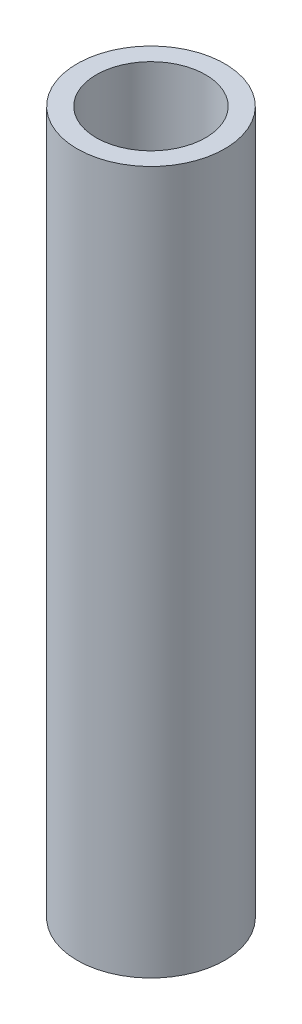
ISO-10303-21;
HEADER;
FILE_DESCRIPTION(('STEP AP214'),'2;1');
FILE_NAME('part.step','',(''),(''),'','','');
FILE_SCHEMA(('AUTOMOTIVE_DESIGN { 1 0 10303 214 1 1 1 1 }'));
ENDSEC;
DATA;
#1=APPLICATION_CONTEXT('core data for automotive mechanical design processes');
#2=APPLICATION_PROTOCOL_DEFINITION('international standard','automotive_design',2000,#1);
#3=PRODUCT_CONTEXT('',#1,'mechanical');
#4=PRODUCT('Part','Part','',(#3));
#5=PRODUCT_RELATED_PRODUCT_CATEGORY('part','',(#4));
#6=PRODUCT_DEFINITION_FORMATION('','',#4);
#7=PRODUCT_DEFINITION_CONTEXT('part definition',#1,'design');
#8=PRODUCT_DEFINITION('design','',#6,#7);
#9=PRODUCT_DEFINITION_SHAPE('','',#8);
#10=(LENGTH_UNIT() NAMED_UNIT(*) SI_UNIT(.MILLI.,.METRE.));
#11=(NAMED_UNIT(*) PLANE_ANGLE_UNIT() SI_UNIT($,.RADIAN.));
#12=(NAMED_UNIT(*) SI_UNIT($,.STERADIAN.) SOLID_ANGLE_UNIT());
#13=UNCERTAINTY_MEASURE_WITH_UNIT(LENGTH_MEASURE(1.E-05),#10,'distance_accuracy_value','');
#14=(GEOMETRIC_REPRESENTATION_CONTEXT(3) GLOBAL_UNCERTAINTY_ASSIGNED_CONTEXT((#13)) GLOBAL_UNIT_ASSIGNED_CONTEXT((#10,
#11,#12)) REPRESENTATION_CONTEXT('',''));
#15=CARTESIAN_POINT('',(0.,0.,0.));
#16=DIRECTION('',(0.,0.,1.));
#17=DIRECTION('',(1.,0.,0.));
#18=AXIS2_PLACEMENT_3D('',#15,#16,#17);
#19=CARTESIAN_POINT('',(0.,101.6,0.));
#20=DIRECTION('',(0.,1.,0.));
#21=DIRECTION('',(0.,0.,1.));
#22=AXIS2_PLACEMENT_3D('',#19,#20,#21);
#23=PLANE('',#22);
#24=CARTESIAN_POINT('',(0.,101.6,0.));
#25=DIRECTION('',(0.,1.,0.));
#26=DIRECTION('',(0.,0.,1.));
#27=AXIS2_PLACEMENT_3D('',#24,#25,#26);
#28=CIRCLE('',#27,10.668);
#29=CARTESIAN_POINT('',(0.,101.6,10.668));
#30=VERTEX_POINT('',#29);
#31=EDGE_CURVE('E10',#30,#30,#28,.T.);
#32=ORIENTED_EDGE('',*,*,#31,.T.);
#33=EDGE_LOOP('',(#32));
#34=FACE_BOUND('',#33,.T.);
#35=CARTESIAN_POINT('',(0.,101.6,0.));
#36=DIRECTION('',(0.,1.,0.));
#37=DIRECTION('',(0.,0.,1.));
#38=AXIS2_PLACEMENT_3D('',#35,#36,#37);
#39=CIRCLE('',#38,7.8994);
#40=CARTESIAN_POINT('',(0.,101.6,7.8994));
#41=VERTEX_POINT('',#40);
#42=EDGE_CURVE('E43',#41,#41,#39,.T.);
#43=ORIENTED_EDGE('',*,*,#42,.F.);
#44=EDGE_LOOP('',(#43));
#45=FACE_BOUND('',#44,.T.);
#46=ADVANCED_FACE('F32',(#34,#45),#23,.T.);
#47=CARTESIAN_POINT('',(0.,0.,0.));
#48=DIRECTION('',(0.,1.,0.));
#49=DIRECTION('',(0.,0.,1.));
#50=AXIS2_PLACEMENT_3D('',#47,#48,#49);
#51=PLANE('',#50);
#52=CARTESIAN_POINT('',(0.,0.,0.));
#53=DIRECTION('',(0.,1.,0.));
#54=DIRECTION('',(0.,0.,1.));
#55=AXIS2_PLACEMENT_3D('',#52,#53,#54);
#56=CIRCLE('',#55,10.668);
#57=CARTESIAN_POINT('',(0.,0.,10.668));
#58=VERTEX_POINT('',#57);
#59=EDGE_CURVE('E36',#58,#58,#56,.T.);
#60=ORIENTED_EDGE('',*,*,#59,.F.);
#61=EDGE_LOOP('',(#60));
#62=FACE_BOUND('',#61,.T.);
#63=CARTESIAN_POINT('',(0.,0.,0.));
#64=DIRECTION('',(0.,1.,0.));
#65=DIRECTION('',(0.,0.,1.));
#66=AXIS2_PLACEMENT_3D('',#63,#64,#65);
#67=CIRCLE('',#66,7.8994);
#68=CARTESIAN_POINT('',(0.,0.,7.8994));
#69=VERTEX_POINT('',#68);
#70=EDGE_CURVE('E45',#69,#69,#67,.T.);
#71=ORIENTED_EDGE('',*,*,#70,.T.);
#72=EDGE_LOOP('',(#71));
#73=FACE_BOUND('',#72,.T.);
#74=ADVANCED_FACE('F55',(#62,#73),#51,.F.);
#75=CARTESIAN_POINT('',(0.,101.6,0.));
#76=DIRECTION('',(0.,-1.,0.));
#77=DIRECTION('',(0.,0.,-1.));
#78=AXIS2_PLACEMENT_3D('',#75,#76,#77);
#79=CYLINDRICAL_SURFACE('',#78,10.668);
#80=ORIENTED_EDGE('',*,*,#31,.F.);
#81=EDGE_LOOP('',(#80));
#82=FACE_BOUND('',#81,.T.);
#83=ORIENTED_EDGE('',*,*,#59,.T.);
#84=EDGE_LOOP('',(#83));
#85=FACE_BOUND('',#84,.T.);
#86=ADVANCED_FACE('F34',(#82,#85),#79,.T.);
#87=CARTESIAN_POINT('',(0.,101.6,0.));
#88=DIRECTION('',(0.,-1.,0.));
#89=DIRECTION('',(0.,0.,-1.));
#90=AXIS2_PLACEMENT_3D('',#87,#88,#89);
#91=CYLINDRICAL_SURFACE('',#90,7.8994);
#92=ORIENTED_EDGE('',*,*,#42,.T.);
#93=EDGE_LOOP('',(#92));
#94=FACE_BOUND('',#93,.T.);
#95=ORIENTED_EDGE('',*,*,#70,.F.);
#96=EDGE_LOOP('',(#95));
#97=FACE_BOUND('',#96,.T.);
#98=ADVANCED_FACE('F51',(#94,#97),#91,.F.);
#99=CLOSED_SHELL('',(#46,#74,#86,#98));
#100=MANIFOLD_SOLID_BREP('B2',#99);
#101=ADVANCED_BREP_SHAPE_REPRESENTATION('',(#18,#100),#14);
#102=SHAPE_DEFINITION_REPRESENTATION(#9,#101);
ENDSEC;
END-ISO-10303-21;
